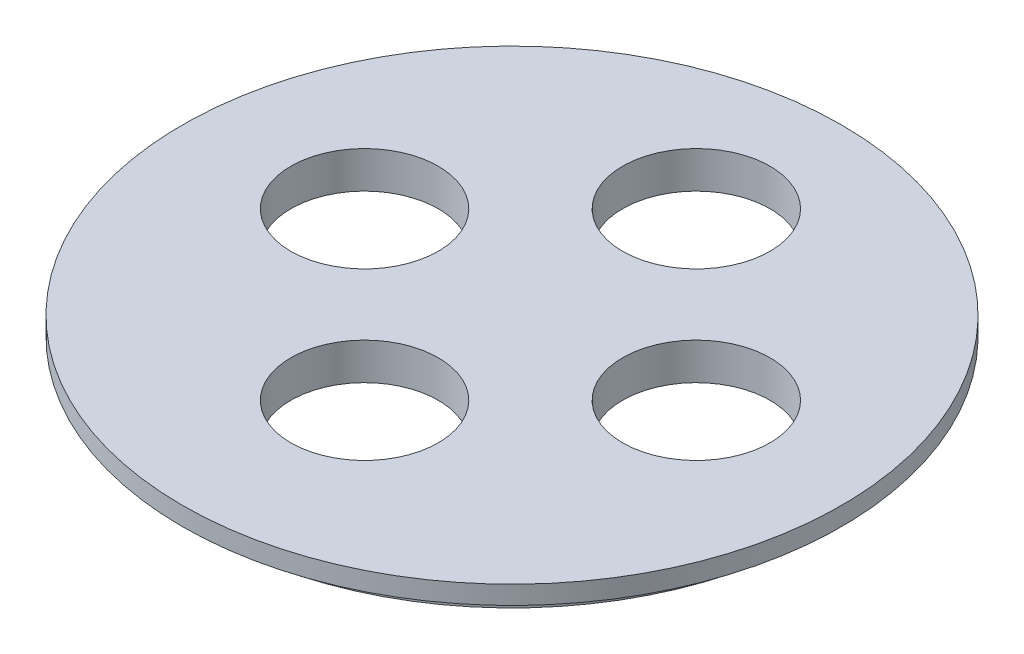
ISO-10303-21;
HEADER;
FILE_DESCRIPTION(('STEP AP214'),'2;1');
FILE_NAME('part.step','',(''),(''),'','','');
FILE_SCHEMA(('AUTOMOTIVE_DESIGN { 1 0 10303 214 1 1 1 1 }'));
ENDSEC;
DATA;
#1=APPLICATION_CONTEXT('core data for automotive mechanical design processes');
#2=APPLICATION_PROTOCOL_DEFINITION('international standard','automotive_design',2000,#1);
#3=PRODUCT_CONTEXT('',#1,'mechanical');
#4=PRODUCT('Part','Part','',(#3));
#5=PRODUCT_RELATED_PRODUCT_CATEGORY('part','',(#4));
#6=PRODUCT_DEFINITION_FORMATION('','',#4);
#7=PRODUCT_DEFINITION_CONTEXT('part definition',#1,'design');
#8=PRODUCT_DEFINITION('design','',#6,#7);
#9=PRODUCT_DEFINITION_SHAPE('','',#8);
#10=(LENGTH_UNIT() NAMED_UNIT(*) SI_UNIT(.MILLI.,.METRE.));
#11=(NAMED_UNIT(*) PLANE_ANGLE_UNIT() SI_UNIT($,.RADIAN.));
#12=(NAMED_UNIT(*) SI_UNIT($,.STERADIAN.) SOLID_ANGLE_UNIT());
#13=UNCERTAINTY_MEASURE_WITH_UNIT(LENGTH_MEASURE(1.E-05),#10,'distance_accuracy_value','');
#14=(GEOMETRIC_REPRESENTATION_CONTEXT(3) GLOBAL_UNCERTAINTY_ASSIGNED_CONTEXT((#13)) GLOBAL_UNIT_ASSIGNED_CONTEXT((#10,
#11,#12)) REPRESENTATION_CONTEXT('',''));
#15=CARTESIAN_POINT('',(0.,0.,0.));
#16=DIRECTION('',(0.,0.,1.));
#17=DIRECTION('',(1.,0.,0.));
#18=AXIS2_PLACEMENT_3D('',#15,#16,#17);
#19=CARTESIAN_POINT('',(0.,3.175,0.));
#20=DIRECTION('',(0.,-1.,0.));
#21=DIRECTION('',(0.,0.,-1.));
#22=AXIS2_PLACEMENT_3D('',#19,#20,#21);
#23=CYLINDRICAL_SURFACE('',#22,56.769);
#24=CARTESIAN_POINT('',(0.,3.175,0.));
#25=DIRECTION('',(0.,1.,0.));
#26=DIRECTION('',(0.,0.,1.));
#27=AXIS2_PLACEMENT_3D('',#24,#25,#26);
#28=CIRCLE('',#27,56.769);
#29=CARTESIAN_POINT('',(0.,3.175,56.769));
#30=VERTEX_POINT('',#29);
#31=EDGE_CURVE('E10',#30,#30,#28,.T.);
#32=ORIENTED_EDGE('',*,*,#31,.F.);
#33=EDGE_LOOP('',(#32));
#34=FACE_BOUND('',#33,.T.);
#35=CARTESIAN_POINT('',(0.,0.,0.));
#36=DIRECTION('',(0.,1.,0.));
#37=DIRECTION('',(0.,0.,1.));
#38=AXIS2_PLACEMENT_3D('',#35,#36,#37);
#39=CIRCLE('',#38,56.769);
#40=CARTESIAN_POINT('',(0.,0.,56.769));
#41=VERTEX_POINT('',#40);
#42=EDGE_CURVE('E42',#41,#41,#39,.T.);
#43=ORIENTED_EDGE('',*,*,#42,.T.);
#44=EDGE_LOOP('',(#43));
#45=FACE_BOUND('',#44,.T.);
#46=ADVANCED_FACE('F39',(#34,#45),#23,.T.);
#47=CARTESIAN_POINT('',(0.,3.175,0.));
#48=DIRECTION('',(0.,1.,0.));
#49=DIRECTION('',(0.,0.,1.));
#50=AXIS2_PLACEMENT_3D('',#47,#48,#49);
#51=PLANE('',#50);
#52=CARTESIAN_POINT('',(0.,3.175,-31.75));
#53=DIRECTION('',(0.,1.,0.));
#54=DIRECTION('',(0.,0.,1.));
#55=AXIS2_PLACEMENT_3D('',#52,#53,#54);
#56=CIRCLE('',#55,12.7);
#57=CARTESIAN_POINT('',(0.,3.175,-19.05));
#58=VERTEX_POINT('',#57);
#59=EDGE_CURVE('E85',#58,#58,#56,.T.);
#60=ORIENTED_EDGE('',*,*,#59,.F.);
#61=EDGE_LOOP('',(#60));
#62=FACE_BOUND('',#61,.T.);
#63=CARTESIAN_POINT('',(28.5750000000007,3.175,-3.17500000000072));
#64=DIRECTION('',(0.,1.,0.));
#65=DIRECTION('',(0.,0.,1.));
#66=AXIS2_PLACEMENT_3D('',#63,#64,#65);
#67=CIRCLE('',#66,12.7);
#68=CARTESIAN_POINT('',(28.5750000000007,3.175,9.52499999999929));
#69=VERTEX_POINT('',#68);
#70=EDGE_CURVE('E77',#69,#69,#67,.T.);
#71=ORIENTED_EDGE('',*,*,#70,.F.);
#72=EDGE_LOOP('',(#71));
#73=FACE_BOUND('',#72,.T.);
#74=CARTESIAN_POINT('',(1.43487985581375E-12,3.175,25.4));
#75=DIRECTION('',(0.,1.,0.));
#76=DIRECTION('',(0.,0.,1.));
#77=AXIS2_PLACEMENT_3D('',#74,#75,#76);
#78=CIRCLE('',#77,12.7);
#79=CARTESIAN_POINT('',(1.43487985581375E-12,3.175,38.1));
#80=VERTEX_POINT('',#79);
#81=EDGE_CURVE('E69',#80,#80,#78,.T.);
#82=ORIENTED_EDGE('',*,*,#81,.F.);
#83=EDGE_LOOP('',(#82));
#84=FACE_BOUND('',#83,.T.);
#85=CARTESIAN_POINT('',(-28.5749999999993,3.175,-3.17499999999928));
#86=DIRECTION('',(0.,1.,0.));
#87=DIRECTION('',(0.,0.,1.));
#88=AXIS2_PLACEMENT_3D('',#85,#86,#87);
#89=CIRCLE('',#88,12.7);
#90=CARTESIAN_POINT('',(-28.5749999999993,3.175,9.52500000000072));
#91=VERTEX_POINT('',#90);
#92=EDGE_CURVE('E61',#91,#91,#89,.T.);
#93=ORIENTED_EDGE('',*,*,#92,.F.);
#94=EDGE_LOOP('',(#93));
#95=FACE_BOUND('',#94,.T.);
#96=ORIENTED_EDGE('',*,*,#31,.T.);
#97=EDGE_LOOP('',(#96));
#98=FACE_BOUND('',#97,.T.);
#99=ADVANCED_FACE('F103',(#62,#73,#84,#95,#98),#51,.T.);
#100=CARTESIAN_POINT('',(0.,0.,0.));
#101=DIRECTION('',(0.,1.,0.));
#102=DIRECTION('',(0.,0.,1.));
#103=AXIS2_PLACEMENT_3D('',#100,#101,#102);
#104=PLANE('',#103);
#105=CARTESIAN_POINT('',(0.,0.,0.));
#106=DIRECTION('',(0.,1.,0.));
#107=DIRECTION('',(0.,0.,1.));
#108=AXIS2_PLACEMENT_3D('',#105,#106,#107);
#109=CIRCLE('',#108,52.80025);
#110=CARTESIAN_POINT('',(0.,0.,52.80025));
#111=VERTEX_POINT('',#110);
#112=EDGE_CURVE('E53',#111,#111,#109,.T.);
#113=ORIENTED_EDGE('',*,*,#112,.T.);
#114=EDGE_LOOP('',(#113));
#115=FACE_BOUND('',#114,.T.);
#116=ORIENTED_EDGE('',*,*,#42,.F.);
#117=EDGE_LOOP('',(#116));
#118=FACE_BOUND('',#117,.T.);
#119=ADVANCED_FACE('F106',(#115,#118),#104,.F.);
#120=CARTESIAN_POINT('',(0.,-3.175,0.));
#121=DIRECTION('',(0.,1.,0.));
#122=DIRECTION('',(0.,0.,1.));
#123=AXIS2_PLACEMENT_3D('',#120,#121,#122);
#124=CYLINDRICAL_SURFACE('',#123,52.80025);
#125=CARTESIAN_POINT('',(0.,-3.175,0.));
#126=DIRECTION('',(0.,1.,0.));
#127=DIRECTION('',(0.,0.,1.));
#128=AXIS2_PLACEMENT_3D('',#125,#126,#127);
#129=CIRCLE('',#128,52.80025);
#130=CARTESIAN_POINT('',(0.,-3.175,52.80025));
#131=VERTEX_POINT('',#130);
#132=EDGE_CURVE('E51',#131,#131,#129,.T.);
#133=ORIENTED_EDGE('',*,*,#132,.T.);
#134=EDGE_LOOP('',(#133));
#135=FACE_BOUND('',#134,.T.);
#136=ORIENTED_EDGE('',*,*,#112,.F.);
#137=EDGE_LOOP('',(#136));
#138=FACE_BOUND('',#137,.T.);
#139=ADVANCED_FACE('F125',(#135,#138),#124,.T.);
#140=CARTESIAN_POINT('',(0.,-3.175,0.));
#141=DIRECTION('',(0.,1.,0.));
#142=DIRECTION('',(0.,0.,1.));
#143=AXIS2_PLACEMENT_3D('',#140,#141,#142);
#144=PLANE('',#143);
#145=CARTESIAN_POINT('',(0.,-3.175,-31.75));
#146=DIRECTION('',(0.,1.,0.));
#147=DIRECTION('',(0.,0.,1.));
#148=AXIS2_PLACEMENT_3D('',#145,#146,#147);
#149=CIRCLE('',#148,12.7);
#150=CARTESIAN_POINT('',(0.,-3.175,-19.05));
#151=VERTEX_POINT('',#150);
#152=EDGE_CURVE('E57',#151,#151,#149,.T.);
#153=ORIENTED_EDGE('',*,*,#152,.T.);
#154=EDGE_LOOP('',(#153));
#155=FACE_BOUND('',#154,.T.);
#156=CARTESIAN_POINT('',(28.5750000000007,-3.175,-3.17500000000072));
#157=DIRECTION('',(0.,1.,0.));
#158=DIRECTION('',(0.,0.,1.));
#159=AXIS2_PLACEMENT_3D('',#156,#157,#158);
#160=CIRCLE('',#159,12.7);
#161=CARTESIAN_POINT('',(28.5750000000007,-3.175,9.52499999999929));
#162=VERTEX_POINT('',#161);
#163=EDGE_CURVE('E81',#162,#162,#160,.T.);
#164=ORIENTED_EDGE('',*,*,#163,.T.);
#165=EDGE_LOOP('',(#164));
#166=FACE_BOUND('',#165,.T.);
#167=CARTESIAN_POINT('',(1.43487985581375E-12,-3.175,25.4));
#168=DIRECTION('',(0.,1.,0.));
#169=DIRECTION('',(0.,0.,1.));
#170=AXIS2_PLACEMENT_3D('',#167,#168,#169);
#171=CIRCLE('',#170,12.7);
#172=CARTESIAN_POINT('',(1.43487985581375E-12,-3.175,38.1));
#173=VERTEX_POINT('',#172);
#174=EDGE_CURVE('E73',#173,#173,#171,.T.);
#175=ORIENTED_EDGE('',*,*,#174,.T.);
#176=EDGE_LOOP('',(#175));
#177=FACE_BOUND('',#176,.T.);
#178=CARTESIAN_POINT('',(-28.5749999999993,-3.175,-3.17499999999928));
#179=DIRECTION('',(0.,1.,0.));
#180=DIRECTION('',(0.,0.,1.));
#181=AXIS2_PLACEMENT_3D('',#178,#179,#180);
#182=CIRCLE('',#181,12.7);
#183=CARTESIAN_POINT('',(-28.5749999999993,-3.175,9.52500000000072));
#184=VERTEX_POINT('',#183);
#185=EDGE_CURVE('E65',#184,#184,#182,.T.);
#186=ORIENTED_EDGE('',*,*,#185,.T.);
#187=EDGE_LOOP('',(#186));
#188=FACE_BOUND('',#187,.T.);
#189=ORIENTED_EDGE('',*,*,#132,.F.);
#190=EDGE_LOOP('',(#189));
#191=FACE_BOUND('',#190,.T.);
#192=ADVANCED_FACE('F93',(#155,#166,#177,#188,#191),#144,.F.);
#193=CARTESIAN_POINT('',(-28.5749999999993,-3.175,-3.17499999999928));
#194=DIRECTION('',(0.,1.,0.));
#195=DIRECTION('',(0.,0.,1.));
#196=AXIS2_PLACEMENT_3D('',#193,#194,#195);
#197=CYLINDRICAL_SURFACE('',#196,12.7);
#198=ORIENTED_EDGE('',*,*,#185,.F.);
#199=EDGE_LOOP('',(#198));
#200=FACE_BOUND('',#199,.T.);
#201=ORIENTED_EDGE('',*,*,#92,.T.);
#202=EDGE_LOOP('',(#201));
#203=FACE_BOUND('',#202,.T.);
#204=ADVANCED_FACE('F114',(#200,#203),#197,.F.);
#205=CARTESIAN_POINT('',(1.43487985581375E-12,-3.175,25.4));
#206=DIRECTION('',(0.,1.,0.));
#207=DIRECTION('',(0.,0.,1.));
#208=AXIS2_PLACEMENT_3D('',#205,#206,#207);
#209=CYLINDRICAL_SURFACE('',#208,12.7);
#210=ORIENTED_EDGE('',*,*,#174,.F.);
#211=EDGE_LOOP('',(#210));
#212=FACE_BOUND('',#211,.T.);
#213=ORIENTED_EDGE('',*,*,#81,.T.);
#214=EDGE_LOOP('',(#213));
#215=FACE_BOUND('',#214,.T.);
#216=ADVANCED_FACE('F116',(#212,#215),#209,.F.);
#217=CARTESIAN_POINT('',(28.5750000000007,-3.175,-3.17500000000072));
#218=DIRECTION('',(0.,1.,0.));
#219=DIRECTION('',(0.,0.,1.));
#220=AXIS2_PLACEMENT_3D('',#217,#218,#219);
#221=CYLINDRICAL_SURFACE('',#220,12.7);
#222=ORIENTED_EDGE('',*,*,#163,.F.);
#223=EDGE_LOOP('',(#222));
#224=FACE_BOUND('',#223,.T.);
#225=ORIENTED_EDGE('',*,*,#70,.T.);
#226=EDGE_LOOP('',(#225));
#227=FACE_BOUND('',#226,.T.);
#228=ADVANCED_FACE('F99',(#224,#227),#221,.F.);
#229=CARTESIAN_POINT('',(0.,-3.175,-31.75));
#230=DIRECTION('',(0.,1.,0.));
#231=DIRECTION('',(0.,0.,1.));
#232=AXIS2_PLACEMENT_3D('',#229,#230,#231);
#233=CYLINDRICAL_SURFACE('',#232,12.7);
#234=ORIENTED_EDGE('',*,*,#152,.F.);
#235=EDGE_LOOP('',(#234));
#236=FACE_BOUND('',#235,.T.);
#237=ORIENTED_EDGE('',*,*,#59,.T.);
#238=EDGE_LOOP('',(#237));
#239=FACE_BOUND('',#238,.T.);
#240=ADVANCED_FACE('F96',(#236,#239),#233,.F.);
#241=CLOSED_SHELL('',(#46,#99,#119,#139,#192,#204,#216,#228,#240));
#242=MANIFOLD_SOLID_BREP('B2',#241);
#243=ADVANCED_BREP_SHAPE_REPRESENTATION('',(#18,#242),#14);
#244=SHAPE_DEFINITION_REPRESENTATION(#9,#243);
ENDSEC;
END-ISO-10303-21;
